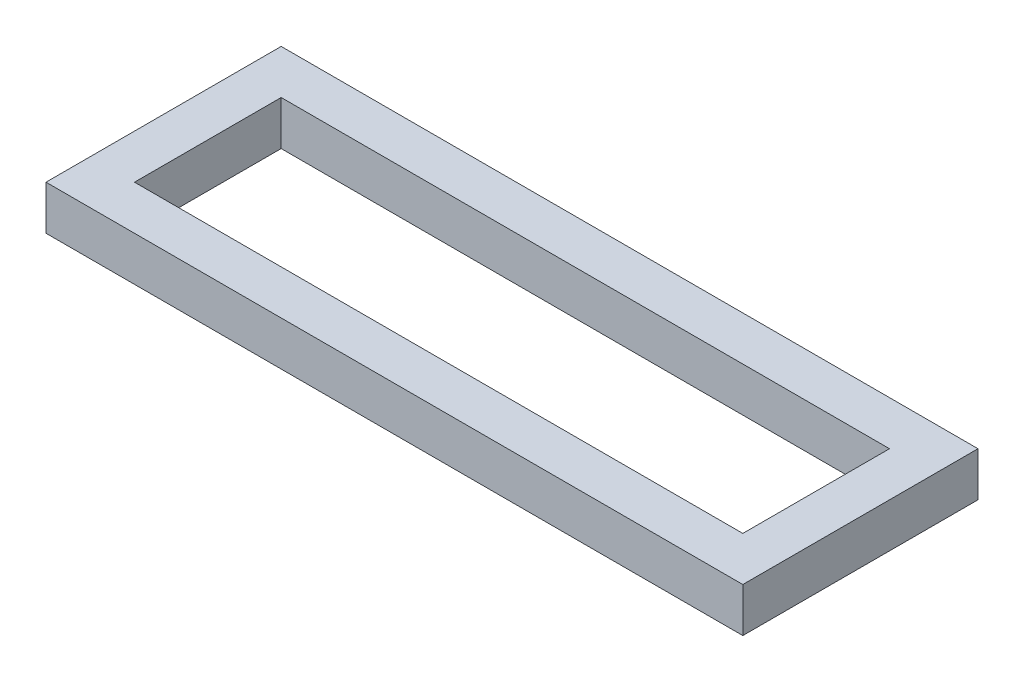
ISO-10303-21;
HEADER;
FILE_DESCRIPTION(('STEP AP214'),'2;1');
FILE_NAME('part.step','',(''),(''),'','','');
FILE_SCHEMA(('AUTOMOTIVE_DESIGN { 1 0 10303 214 1 1 1 1 }'));
ENDSEC;
DATA;
#1=APPLICATION_CONTEXT('core data for automotive mechanical design processes');
#2=APPLICATION_PROTOCOL_DEFINITION('international standard','automotive_design',2000,#1);
#3=PRODUCT_CONTEXT('',#1,'mechanical');
#4=PRODUCT('Part','Part','',(#3));
#5=PRODUCT_RELATED_PRODUCT_CATEGORY('part','',(#4));
#6=PRODUCT_DEFINITION_FORMATION('','',#4);
#7=PRODUCT_DEFINITION_CONTEXT('part definition',#1,'design');
#8=PRODUCT_DEFINITION('design','',#6,#7);
#9=PRODUCT_DEFINITION_SHAPE('','',#8);
#10=(LENGTH_UNIT() NAMED_UNIT(*) SI_UNIT(.MILLI.,.METRE.));
#11=(NAMED_UNIT(*) PLANE_ANGLE_UNIT() SI_UNIT($,.RADIAN.));
#12=(NAMED_UNIT(*) SI_UNIT($,.STERADIAN.) SOLID_ANGLE_UNIT());
#13=UNCERTAINTY_MEASURE_WITH_UNIT(LENGTH_MEASURE(1.E-05),#10,'distance_accuracy_value','');
#14=(GEOMETRIC_REPRESENTATION_CONTEXT(3) GLOBAL_UNCERTAINTY_ASSIGNED_CONTEXT((#13)) GLOBAL_UNIT_ASSIGNED_CONTEXT((#10,
#11,#12)) REPRESENTATION_CONTEXT('',''));
#15=CARTESIAN_POINT('',(0.,0.,0.));
#16=DIRECTION('',(0.,0.,1.));
#17=DIRECTION('',(1.,0.,0.));
#18=AXIS2_PLACEMENT_3D('',#15,#16,#17);
#19=CARTESIAN_POINT('',(0.,25.4,0.));
#20=DIRECTION('',(0.,-1.,0.));
#21=DIRECTION('',(0.,0.,-1.));
#22=AXIS2_PLACEMENT_3D('',#19,#20,#21);
#23=PLANE('',#22);
#24=DIRECTION('',(0.,0.,-1.));
#25=VECTOR('',#24,1.);
#26=CARTESIAN_POINT('',(200.,25.4,67.5));
#27=LINE('',#26,#25);
#28=CARTESIAN_POINT('',(200.,25.4,67.5));
#29=VERTEX_POINT('',#28);
#30=CARTESIAN_POINT('',(200.,25.4,-67.5));
#31=VERTEX_POINT('',#30);
#32=EDGE_CURVE('E136',#29,#31,#27,.T.);
#33=ORIENTED_EDGE('',*,*,#32,.T.);
#34=DIRECTION('',(-1.,0.,0.));
#35=VECTOR('',#34,1.);
#36=CARTESIAN_POINT('',(-200.,25.4,-67.5));
#37=LINE('',#36,#35);
#38=CARTESIAN_POINT('',(-200.,25.4,-67.5));
#39=VERTEX_POINT('',#38);
#40=EDGE_CURVE('E139',#31,#39,#37,.T.);
#41=ORIENTED_EDGE('',*,*,#40,.T.);
#42=DIRECTION('',(0.,0.,1.));
#43=VECTOR('',#42,1.);
#44=CARTESIAN_POINT('',(-200.,25.4,67.5));
#45=LINE('',#44,#43);
#46=CARTESIAN_POINT('',(-200.,25.4,67.5));
#47=VERTEX_POINT('',#46);
#48=EDGE_CURVE('E142',#39,#47,#45,.T.);
#49=ORIENTED_EDGE('',*,*,#48,.T.);
#50=DIRECTION('',(1.,0.,0.));
#51=VECTOR('',#50,1.);
#52=CARTESIAN_POINT('',(-200.,25.4,67.5));
#53=LINE('',#52,#51);
#54=EDGE_CURVE('E144',#47,#29,#53,.T.);
#55=ORIENTED_EDGE('',*,*,#54,.T.);
#56=EDGE_LOOP('',(#33,#41,#49,#55));
#57=FACE_BOUND('',#56,.T.);
#58=DIRECTION('',(0.,0.,-1.));
#59=VECTOR('',#58,1.);
#60=CARTESIAN_POINT('',(174.6,25.4,42.1));
#61=LINE('',#60,#59);
#62=CARTESIAN_POINT('',(174.6,25.4,42.1));
#63=VERTEX_POINT('',#62);
#64=CARTESIAN_POINT('',(174.6,25.4,-42.1));
#65=VERTEX_POINT('',#64);
#66=EDGE_CURVE('E100',#63,#65,#61,.T.);
#67=ORIENTED_EDGE('',*,*,#66,.F.);
#68=DIRECTION('',(1.,0.,0.));
#69=VECTOR('',#68,1.);
#70=CARTESIAN_POINT('',(-174.6,25.4,42.1));
#71=LINE('',#70,#69);
#72=CARTESIAN_POINT('',(-174.6,25.4,42.1));
#73=VERTEX_POINT('',#72);
#74=EDGE_CURVE('E122',#73,#63,#71,.T.);
#75=ORIENTED_EDGE('',*,*,#74,.F.);
#76=DIRECTION('',(0.,0.,1.));
#77=VECTOR('',#76,1.);
#78=CARTESIAN_POINT('',(-174.6,25.4,42.1));
#79=LINE('',#78,#77);
#80=CARTESIAN_POINT('',(-174.6,25.4,-42.1));
#81=VERTEX_POINT('',#80);
#82=EDGE_CURVE('E120',#81,#73,#79,.T.);
#83=ORIENTED_EDGE('',*,*,#82,.F.);
#84=DIRECTION('',(-1.,0.,0.));
#85=VECTOR('',#84,1.);
#86=CARTESIAN_POINT('',(-174.6,25.4,-42.1));
#87=LINE('',#86,#85);
#88=EDGE_CURVE('E108',#65,#81,#87,.T.);
#89=ORIENTED_EDGE('',*,*,#88,.F.);
#90=EDGE_LOOP('',(#67,#75,#83,#89));
#91=FACE_BOUND('',#90,.T.);
#92=ADVANCED_FACE('F35',(#57,#91),#23,.F.);
#93=CARTESIAN_POINT('',(0.,0.,0.));
#94=DIRECTION('',(0.,-1.,0.));
#95=DIRECTION('',(0.,0.,-1.));
#96=AXIS2_PLACEMENT_3D('',#93,#94,#95);
#97=PLANE('',#96);
#98=DIRECTION('',(0.,0.,-1.));
#99=VECTOR('',#98,1.);
#100=CARTESIAN_POINT('',(200.,0.,67.5));
#101=LINE('',#100,#99);
#102=CARTESIAN_POINT('',(200.,0.,67.5));
#103=VERTEX_POINT('',#102);
#104=CARTESIAN_POINT('',(200.,0.,-67.5));
#105=VERTEX_POINT('',#104);
#106=EDGE_CURVE('E116',#103,#105,#101,.T.);
#107=ORIENTED_EDGE('',*,*,#106,.F.);
#108=DIRECTION('',(1.,0.,0.));
#109=VECTOR('',#108,1.);
#110=CARTESIAN_POINT('',(-200.,0.,67.5));
#111=LINE('',#110,#109);
#112=CARTESIAN_POINT('',(-200.,0.,67.5));
#113=VERTEX_POINT('',#112);
#114=EDGE_CURVE('E140',#113,#103,#111,.T.);
#115=ORIENTED_EDGE('',*,*,#114,.F.);
#116=DIRECTION('',(0.,0.,1.));
#117=VECTOR('',#116,1.);
#118=CARTESIAN_POINT('',(-200.,0.,67.5));
#119=LINE('',#118,#117);
#120=CARTESIAN_POINT('',(-200.,0.,-67.5));
#121=VERTEX_POINT('',#120);
#122=EDGE_CURVE('E151',#121,#113,#119,.T.);
#123=ORIENTED_EDGE('',*,*,#122,.F.);
#124=DIRECTION('',(-1.,0.,0.));
#125=VECTOR('',#124,1.);
#126=CARTESIAN_POINT('',(-200.,0.,-67.5));
#127=LINE('',#126,#125);
#128=EDGE_CURVE('E149',#105,#121,#127,.T.);
#129=ORIENTED_EDGE('',*,*,#128,.F.);
#130=EDGE_LOOP('',(#107,#115,#123,#129));
#131=FACE_BOUND('',#130,.T.);
#132=DIRECTION('',(1.,0.,0.));
#133=VECTOR('',#132,1.);
#134=CARTESIAN_POINT('',(-174.6,0.,42.1));
#135=LINE('',#134,#133);
#136=CARTESIAN_POINT('',(-174.6,0.,42.1));
#137=VERTEX_POINT('',#136);
#138=CARTESIAN_POINT('',(174.6,0.,42.1));
#139=VERTEX_POINT('',#138);
#140=EDGE_CURVE('E109',#137,#139,#135,.T.);
#141=ORIENTED_EDGE('',*,*,#140,.T.);
#142=DIRECTION('',(0.,0.,-1.));
#143=VECTOR('',#142,1.);
#144=CARTESIAN_POINT('',(174.6,0.,42.1));
#145=LINE('',#144,#143);
#146=CARTESIAN_POINT('',(174.6,0.,-42.1));
#147=VERTEX_POINT('',#146);
#148=EDGE_CURVE('E58',#139,#147,#145,.T.);
#149=ORIENTED_EDGE('',*,*,#148,.T.);
#150=DIRECTION('',(-1.,0.,0.));
#151=VECTOR('',#150,1.);
#152=CARTESIAN_POINT('',(-174.6,0.,-42.1));
#153=LINE('',#152,#151);
#154=CARTESIAN_POINT('',(-174.6,0.,-42.1));
#155=VERTEX_POINT('',#154);
#156=EDGE_CURVE('E115',#147,#155,#153,.T.);
#157=ORIENTED_EDGE('',*,*,#156,.T.);
#158=DIRECTION('',(0.,0.,1.));
#159=VECTOR('',#158,1.);
#160=CARTESIAN_POINT('',(-174.6,0.,42.1));
#161=LINE('',#160,#159);
#162=EDGE_CURVE('E128',#155,#137,#161,.T.);
#163=ORIENTED_EDGE('',*,*,#162,.T.);
#164=EDGE_LOOP('',(#141,#149,#157,#163));
#165=FACE_BOUND('',#164,.T.);
#166=ADVANCED_FACE('F169',(#131,#165),#97,.T.);
#167=CARTESIAN_POINT('',(200.,25.4,67.5));
#168=DIRECTION('',(-1.,0.,0.));
#169=DIRECTION('',(0.,0.,1.));
#170=AXIS2_PLACEMENT_3D('',#167,#168,#169);
#171=PLANE('',#170);
#172=ORIENTED_EDGE('',*,*,#106,.T.);
#173=DIRECTION('',(0.,-1.,0.));
#174=VECTOR('',#173,1.);
#175=CARTESIAN_POINT('',(200.,25.4,-67.5));
#176=LINE('',#175,#174);
#177=EDGE_CURVE('E11',#31,#105,#176,.T.);
#178=ORIENTED_EDGE('',*,*,#177,.F.);
#179=ORIENTED_EDGE('',*,*,#32,.F.);
#180=DIRECTION('',(0.,-1.,0.));
#181=VECTOR('',#180,1.);
#182=CARTESIAN_POINT('',(200.,25.4,67.5));
#183=LINE('',#182,#181);
#184=EDGE_CURVE('E146',#29,#103,#183,.T.);
#185=ORIENTED_EDGE('',*,*,#184,.T.);
#186=EDGE_LOOP('',(#172,#178,#179,#185));
#187=FACE_BOUND('',#186,.T.);
#188=ADVANCED_FACE('F37',(#187),#171,.F.);
#189=CARTESIAN_POINT('',(-200.,25.4,-67.5));
#190=DIRECTION('',(0.,0.,1.));
#191=DIRECTION('',(1.,0.,0.));
#192=AXIS2_PLACEMENT_3D('',#189,#190,#191);
#193=PLANE('',#192);
#194=ORIENTED_EDGE('',*,*,#128,.T.);
#195=DIRECTION('',(0.,-1.,0.));
#196=VECTOR('',#195,1.);
#197=CARTESIAN_POINT('',(-200.,25.4,-67.5));
#198=LINE('',#197,#196);
#199=EDGE_CURVE('E43',#39,#121,#198,.T.);
#200=ORIENTED_EDGE('',*,*,#199,.F.);
#201=ORIENTED_EDGE('',*,*,#40,.F.);
#202=ORIENTED_EDGE('',*,*,#177,.T.);
#203=EDGE_LOOP('',(#194,#200,#201,#202));
#204=FACE_BOUND('',#203,.T.);
#205=ADVANCED_FACE('F179',(#204),#193,.F.);
#206=CARTESIAN_POINT('',(-200.,25.4,67.5));
#207=DIRECTION('',(1.,0.,0.));
#208=DIRECTION('',(0.,0.,-1.));
#209=AXIS2_PLACEMENT_3D('',#206,#207,#208);
#210=PLANE('',#209);
#211=ORIENTED_EDGE('',*,*,#122,.T.);
#212=DIRECTION('',(0.,-1.,0.));
#213=VECTOR('',#212,1.);
#214=CARTESIAN_POINT('',(-200.,25.4,67.5));
#215=LINE('',#214,#213);
#216=EDGE_CURVE('E156',#47,#113,#215,.T.);
#217=ORIENTED_EDGE('',*,*,#216,.F.);
#218=ORIENTED_EDGE('',*,*,#48,.F.);
#219=ORIENTED_EDGE('',*,*,#199,.T.);
#220=EDGE_LOOP('',(#211,#217,#218,#219));
#221=FACE_BOUND('',#220,.T.);
#222=ADVANCED_FACE('F163',(#221),#210,.F.);
#223=CARTESIAN_POINT('',(-200.,25.4,67.5));
#224=DIRECTION('',(0.,0.,-1.));
#225=DIRECTION('',(-1.,0.,0.));
#226=AXIS2_PLACEMENT_3D('',#223,#224,#225);
#227=PLANE('',#226);
#228=ORIENTED_EDGE('',*,*,#114,.T.);
#229=ORIENTED_EDGE('',*,*,#184,.F.);
#230=ORIENTED_EDGE('',*,*,#54,.F.);
#231=ORIENTED_EDGE('',*,*,#216,.T.);
#232=EDGE_LOOP('',(#228,#229,#230,#231));
#233=FACE_BOUND('',#232,.T.);
#234=ADVANCED_FACE('F173',(#233),#227,.F.);
#235=CARTESIAN_POINT('',(174.6,25.4,42.1));
#236=DIRECTION('',(-1.,0.,0.));
#237=DIRECTION('',(0.,0.,1.));
#238=AXIS2_PLACEMENT_3D('',#235,#236,#237);
#239=PLANE('',#238);
#240=ORIENTED_EDGE('',*,*,#148,.F.);
#241=DIRECTION('',(0.,-1.,0.));
#242=VECTOR('',#241,1.);
#243=CARTESIAN_POINT('',(174.6,25.4,42.1));
#244=LINE('',#243,#242);
#245=EDGE_CURVE('E104',#63,#139,#244,.T.);
#246=ORIENTED_EDGE('',*,*,#245,.F.);
#247=ORIENTED_EDGE('',*,*,#66,.T.);
#248=DIRECTION('',(0.,-1.,0.));
#249=VECTOR('',#248,1.);
#250=CARTESIAN_POINT('',(174.6,25.4,-42.1));
#251=LINE('',#250,#249);
#252=EDGE_CURVE('E103',#65,#147,#251,.T.);
#253=ORIENTED_EDGE('',*,*,#252,.T.);
#254=EDGE_LOOP('',(#240,#246,#247,#253));
#255=FACE_BOUND('',#254,.T.);
#256=ADVANCED_FACE('F102',(#255),#239,.T.);
#257=CARTESIAN_POINT('',(-174.6,25.4,-42.1));
#258=DIRECTION('',(0.,0.,1.));
#259=DIRECTION('',(1.,0.,0.));
#260=AXIS2_PLACEMENT_3D('',#257,#258,#259);
#261=PLANE('',#260);
#262=ORIENTED_EDGE('',*,*,#156,.F.);
#263=ORIENTED_EDGE('',*,*,#252,.F.);
#264=ORIENTED_EDGE('',*,*,#88,.T.);
#265=DIRECTION('',(0.,-1.,0.));
#266=VECTOR('',#265,1.);
#267=CARTESIAN_POINT('',(-174.6,25.4,-42.1));
#268=LINE('',#267,#266);
#269=EDGE_CURVE('E117',#81,#155,#268,.T.);
#270=ORIENTED_EDGE('',*,*,#269,.T.);
#271=EDGE_LOOP('',(#262,#263,#264,#270));
#272=FACE_BOUND('',#271,.T.);
#273=ADVANCED_FACE('F112',(#272),#261,.T.);
#274=CARTESIAN_POINT('',(-174.6,25.4,42.1));
#275=DIRECTION('',(1.,0.,0.));
#276=DIRECTION('',(0.,0.,-1.));
#277=AXIS2_PLACEMENT_3D('',#274,#275,#276);
#278=PLANE('',#277);
#279=ORIENTED_EDGE('',*,*,#162,.F.);
#280=ORIENTED_EDGE('',*,*,#269,.F.);
#281=ORIENTED_EDGE('',*,*,#82,.T.);
#282=DIRECTION('',(0.,-1.,0.));
#283=VECTOR('',#282,1.);
#284=CARTESIAN_POINT('',(-174.6,25.4,42.1));
#285=LINE('',#284,#283);
#286=EDGE_CURVE('E50',#73,#137,#285,.T.);
#287=ORIENTED_EDGE('',*,*,#286,.T.);
#288=EDGE_LOOP('',(#279,#280,#281,#287));
#289=FACE_BOUND('',#288,.T.);
#290=ADVANCED_FACE('F202',(#289),#278,.T.);
#291=CARTESIAN_POINT('',(-174.6,25.4,42.1));
#292=DIRECTION('',(0.,0.,-1.));
#293=DIRECTION('',(-1.,0.,0.));
#294=AXIS2_PLACEMENT_3D('',#291,#292,#293);
#295=PLANE('',#294);
#296=ORIENTED_EDGE('',*,*,#140,.F.);
#297=ORIENTED_EDGE('',*,*,#286,.F.);
#298=ORIENTED_EDGE('',*,*,#74,.T.);
#299=ORIENTED_EDGE('',*,*,#245,.T.);
#300=EDGE_LOOP('',(#296,#297,#298,#299));
#301=FACE_BOUND('',#300,.T.);
#302=ADVANCED_FACE('F206',(#301),#295,.T.);
#303=CLOSED_SHELL('',(#92,#166,#188,#205,#222,#234,#256,#273,#290,#302));
#304=MANIFOLD_SOLID_BREP('B2',#303);
#305=ADVANCED_BREP_SHAPE_REPRESENTATION('',(#18,#304),#14);
#306=SHAPE_DEFINITION_REPRESENTATION(#9,#305);
ENDSEC;
END-ISO-10303-21;
